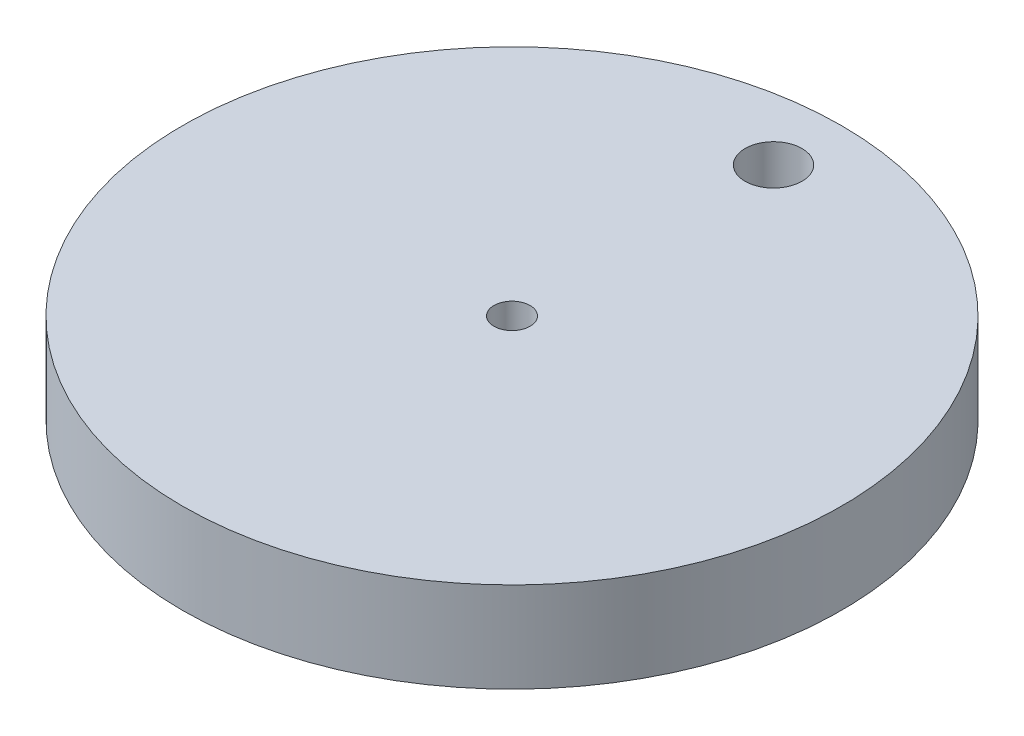
ISO-10303-21;
HEADER;
FILE_DESCRIPTION(('STEP AP214'),'2;1');
FILE_NAME('part.step','',(''),(''),'','','');
FILE_SCHEMA(('AUTOMOTIVE_DESIGN { 1 0 10303 214 1 1 1 1 }'));
ENDSEC;
DATA;
#1=APPLICATION_CONTEXT('core data for automotive mechanical design processes');
#2=APPLICATION_PROTOCOL_DEFINITION('international standard','automotive_design',2000,#1);
#3=PRODUCT_CONTEXT('',#1,'mechanical');
#4=PRODUCT('Part','Part','',(#3));
#5=PRODUCT_RELATED_PRODUCT_CATEGORY('part','',(#4));
#6=PRODUCT_DEFINITION_FORMATION('','',#4);
#7=PRODUCT_DEFINITION_CONTEXT('part definition',#1,'design');
#8=PRODUCT_DEFINITION('design','',#6,#7);
#9=PRODUCT_DEFINITION_SHAPE('','',#8);
#10=(LENGTH_UNIT() NAMED_UNIT(*) SI_UNIT(.MILLI.,.METRE.));
#11=(NAMED_UNIT(*) PLANE_ANGLE_UNIT() SI_UNIT($,.RADIAN.));
#12=(NAMED_UNIT(*) SI_UNIT($,.STERADIAN.) SOLID_ANGLE_UNIT());
#13=UNCERTAINTY_MEASURE_WITH_UNIT(LENGTH_MEASURE(1.E-05),#10,'distance_accuracy_value','');
#14=(GEOMETRIC_REPRESENTATION_CONTEXT(3) GLOBAL_UNCERTAINTY_ASSIGNED_CONTEXT((#13)) GLOBAL_UNIT_ASSIGNED_CONTEXT((#10,
#11,#12)) REPRESENTATION_CONTEXT('',''));
#15=CARTESIAN_POINT('',(0.,0.,0.));
#16=DIRECTION('',(0.,0.,1.));
#17=DIRECTION('',(1.,0.,0.));
#18=AXIS2_PLACEMENT_3D('',#15,#16,#17);
#19=CARTESIAN_POINT('',(0.,12.7,0.));
#20=DIRECTION('',(0.,1.,0.));
#21=DIRECTION('',(0.,0.,1.));
#22=AXIS2_PLACEMENT_3D('',#19,#20,#21);
#23=PLANE('',#22);
#24=CARTESIAN_POINT('',(0.,12.7,0.));
#25=DIRECTION('',(0.,1.,0.));
#26=DIRECTION('',(0.,0.,1.));
#27=AXIS2_PLACEMENT_3D('',#24,#25,#26);
#28=CIRCLE('',#27,2.54);
#29=CARTESIAN_POINT('',(0.,12.7,2.54));
#30=VERTEX_POINT('',#29);
#31=EDGE_CURVE('E42',#30,#30,#28,.T.);
#32=ORIENTED_EDGE('',*,*,#31,.F.);
#33=EDGE_LOOP('',(#32));
#34=FACE_BOUND('',#33,.T.);
#35=CARTESIAN_POINT('',(0.,12.7,0.));
#36=DIRECTION('',(0.,1.,0.));
#37=DIRECTION('',(0.,0.,1.));
#38=AXIS2_PLACEMENT_3D('',#35,#36,#37);
#39=CIRCLE('',#38,46.355);
#40=CARTESIAN_POINT('',(0.,12.7,46.355));
#41=VERTEX_POINT('',#40);
#42=EDGE_CURVE('E10',#41,#41,#39,.T.);
#43=ORIENTED_EDGE('',*,*,#42,.T.);
#44=EDGE_LOOP('',(#43));
#45=FACE_BOUND('',#44,.T.);
#46=CARTESIAN_POINT('',(0.,12.7,-36.7850165615024));
#47=DIRECTION('',(0.,1.,0.));
#48=DIRECTION('',(0.,0.,1.));
#49=AXIS2_PLACEMENT_3D('',#46,#47,#48);
#50=CIRCLE('',#49,4.);
#51=CARTESIAN_POINT('',(0.,12.7,-32.7850165615024));
#52=VERTEX_POINT('',#51);
#53=EDGE_CURVE('E47',#52,#52,#50,.T.);
#54=ORIENTED_EDGE('',*,*,#53,.F.);
#55=EDGE_LOOP('',(#54));
#56=FACE_BOUND('',#55,.T.);
#57=ADVANCED_FACE('F31',(#34,#45,#56),#23,.T.);
#58=CARTESIAN_POINT('',(0.,0.,0.));
#59=DIRECTION('',(0.,1.,0.));
#60=DIRECTION('',(0.,0.,1.));
#61=AXIS2_PLACEMENT_3D('',#58,#59,#60);
#62=PLANE('',#61);
#63=CARTESIAN_POINT('',(0.,0.,0.));
#64=DIRECTION('',(0.,1.,0.));
#65=DIRECTION('',(0.,0.,1.));
#66=AXIS2_PLACEMENT_3D('',#63,#64,#65);
#67=CIRCLE('',#66,46.355);
#68=CARTESIAN_POINT('',(0.,0.,46.355));
#69=VERTEX_POINT('',#68);
#70=EDGE_CURVE('E35',#69,#69,#67,.T.);
#71=ORIENTED_EDGE('',*,*,#70,.F.);
#72=EDGE_LOOP('',(#71));
#73=FACE_BOUND('',#72,.T.);
#74=CARTESIAN_POINT('',(0.,0.,0.));
#75=DIRECTION('',(0.,1.,0.));
#76=DIRECTION('',(0.,0.,1.));
#77=AXIS2_PLACEMENT_3D('',#74,#75,#76);
#78=CIRCLE('',#77,2.54);
#79=CARTESIAN_POINT('',(0.,0.,2.54));
#80=VERTEX_POINT('',#79);
#81=EDGE_CURVE('E44',#80,#80,#78,.T.);
#82=ORIENTED_EDGE('',*,*,#81,.T.);
#83=EDGE_LOOP('',(#82));
#84=FACE_BOUND('',#83,.T.);
#85=CARTESIAN_POINT('',(0.,0.,-36.7850165615024));
#86=DIRECTION('',(0.,1.,0.));
#87=DIRECTION('',(0.,0.,1.));
#88=AXIS2_PLACEMENT_3D('',#85,#86,#87);
#89=CIRCLE('',#88,4.);
#90=CARTESIAN_POINT('',(0.,0.,-32.7850165615024));
#91=VERTEX_POINT('',#90);
#92=EDGE_CURVE('E50',#91,#91,#89,.T.);
#93=ORIENTED_EDGE('',*,*,#92,.T.);
#94=EDGE_LOOP('',(#93));
#95=FACE_BOUND('',#94,.T.);
#96=ADVANCED_FACE('F60',(#73,#84,#95),#62,.F.);
#97=CARTESIAN_POINT('',(0.,12.7,0.));
#98=DIRECTION('',(0.,-1.,0.));
#99=DIRECTION('',(0.,0.,-1.));
#100=AXIS2_PLACEMENT_3D('',#97,#98,#99);
#101=CYLINDRICAL_SURFACE('',#100,46.355);
#102=ORIENTED_EDGE('',*,*,#42,.F.);
#103=EDGE_LOOP('',(#102));
#104=FACE_BOUND('',#103,.T.);
#105=ORIENTED_EDGE('',*,*,#70,.T.);
#106=EDGE_LOOP('',(#105));
#107=FACE_BOUND('',#106,.T.);
#108=ADVANCED_FACE('F33',(#104,#107),#101,.T.);
#109=CARTESIAN_POINT('',(0.,12.7,0.));
#110=DIRECTION('',(0.,-1.,0.));
#111=DIRECTION('',(0.,0.,-1.));
#112=AXIS2_PLACEMENT_3D('',#109,#110,#111);
#113=CYLINDRICAL_SURFACE('',#112,2.54);
#114=ORIENTED_EDGE('',*,*,#31,.T.);
#115=EDGE_LOOP('',(#114));
#116=FACE_BOUND('',#115,.T.);
#117=ORIENTED_EDGE('',*,*,#81,.F.);
#118=EDGE_LOOP('',(#117));
#119=FACE_BOUND('',#118,.T.);
#120=ADVANCED_FACE('F69',(#116,#119),#113,.F.);
#121=CARTESIAN_POINT('',(0.,12.7,-36.7850165615024));
#122=DIRECTION('',(0.,-1.,0.));
#123=DIRECTION('',(0.,0.,-1.));
#124=AXIS2_PLACEMENT_3D('',#121,#122,#123);
#125=CYLINDRICAL_SURFACE('',#124,4.);
#126=ORIENTED_EDGE('',*,*,#53,.T.);
#127=EDGE_LOOP('',(#126));
#128=FACE_BOUND('',#127,.T.);
#129=ORIENTED_EDGE('',*,*,#92,.F.);
#130=EDGE_LOOP('',(#129));
#131=FACE_BOUND('',#130,.T.);
#132=ADVANCED_FACE('F56',(#128,#131),#125,.F.);
#133=CLOSED_SHELL('',(#57,#96,#108,#120,#132));
#134=MANIFOLD_SOLID_BREP('B2',#133);
#135=ADVANCED_BREP_SHAPE_REPRESENTATION('',(#18,#134),#14);
#136=SHAPE_DEFINITION_REPRESENTATION(#9,#135);
ENDSEC;
END-ISO-10303-21;
